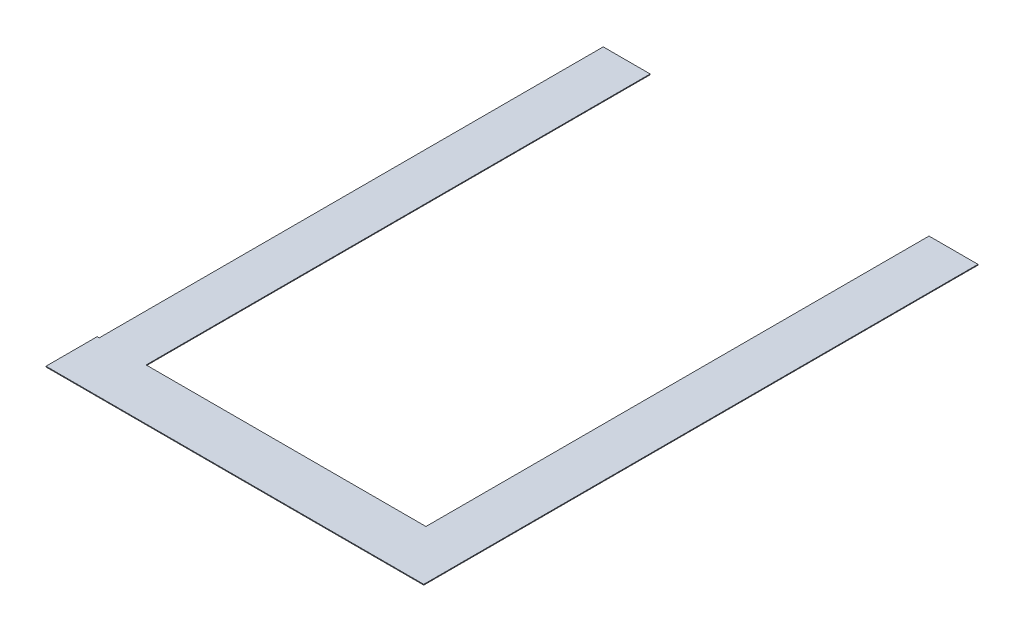
ISO-10303-21;
HEADER;
FILE_DESCRIPTION(('STEP AP214'),'2;1');
FILE_NAME('part.step','',(''),(''),'','','');
FILE_SCHEMA(('AUTOMOTIVE_DESIGN { 1 0 10303 214 1 1 1 1 }'));
ENDSEC;
DATA;
#1=APPLICATION_CONTEXT('core data for automotive mechanical design processes');
#2=APPLICATION_PROTOCOL_DEFINITION('international standard','automotive_design',2000,#1);
#3=PRODUCT_CONTEXT('',#1,'mechanical');
#4=PRODUCT('Part','Part','',(#3));
#5=PRODUCT_RELATED_PRODUCT_CATEGORY('part','',(#4));
#6=PRODUCT_DEFINITION_FORMATION('','',#4);
#7=PRODUCT_DEFINITION_CONTEXT('part definition',#1,'design');
#8=PRODUCT_DEFINITION('design','',#6,#7);
#9=PRODUCT_DEFINITION_SHAPE('','',#8);
#10=(LENGTH_UNIT() NAMED_UNIT(*) SI_UNIT(.MILLI.,.METRE.));
#11=(NAMED_UNIT(*) PLANE_ANGLE_UNIT() SI_UNIT($,.RADIAN.));
#12=(NAMED_UNIT(*) SI_UNIT($,.STERADIAN.) SOLID_ANGLE_UNIT());
#13=UNCERTAINTY_MEASURE_WITH_UNIT(LENGTH_MEASURE(1.E-05),#10,'distance_accuracy_value','');
#14=(GEOMETRIC_REPRESENTATION_CONTEXT(3) GLOBAL_UNCERTAINTY_ASSIGNED_CONTEXT((#13)) GLOBAL_UNIT_ASSIGNED_CONTEXT((#10,
#11,#12)) REPRESENTATION_CONTEXT('',''));
#15=CARTESIAN_POINT('',(0.,0.,0.));
#16=DIRECTION('',(0.,0.,1.));
#17=DIRECTION('',(1.,0.,0.));
#18=AXIS2_PLACEMENT_3D('',#15,#16,#17);
#19=CARTESIAN_POINT('',(4.62818255216973,1.4011,-3.42742028185391));
#20=DIRECTION('',(0.,1.,0.));
#21=DIRECTION('',(0.,0.,1.));
#22=AXIS2_PLACEMENT_3D('',#19,#20,#21);
#23=PLANE('',#22);
#24=DIRECTION('',(0.,0.,1.));
#25=VECTOR('',#24,1.);
#26=CARTESIAN_POINT('',(5.04133181301125,1.4011,-3.80427841803244));
#27=LINE('',#26,#25);
#28=CARTESIAN_POINT('',(5.04133181301125,1.4011,-3.11893098203462));
#29=VERTEX_POINT('',#28);
#30=CARTESIAN_POINT('',(5.04133181301125,1.4011,-3.80427841803244));
#31=VERTEX_POINT('',#30);
#32=EDGE_CURVE('E108',#29,#31,#27,.F.);
#33=ORIENTED_EDGE('',*,*,#32,.F.);
#34=DIRECTION('',(-1.,0.,0.));
#35=VECTOR('',#34,1.);
#36=CARTESIAN_POINT('',(5.10807001996172,1.4011,-3.11893098203462));
#37=LINE('',#36,#35);
#38=CARTESIAN_POINT('',(4.66014241475359,1.4011,-3.11893098203462));
#39=VERTEX_POINT('',#38);
#40=EDGE_CURVE('E137',#39,#29,#37,.F.);
#41=ORIENTED_EDGE('',*,*,#40,.F.);
#42=DIRECTION('',(0.,0.,-1.));
#43=VECTOR('',#42,1.);
#44=CARTESIAN_POINT('',(4.66014241475359,1.4011,-3.04926487408599));
#45=LINE('',#44,#43);
#46=CARTESIAN_POINT('',(4.66014241475359,1.4011,-3.80557568962184));
#47=VERTEX_POINT('',#46);
#48=EDGE_CURVE('E136',#47,#39,#45,.F.);
#49=ORIENTED_EDGE('',*,*,#48,.F.);
#50=DIRECTION('',(-1.,0.,0.));
#51=VECTOR('',#50,1.);
#52=CARTESIAN_POINT('',(4.66014241475359,1.4011,-3.80557568962184));
#53=LINE('',#52,#51);
#54=CARTESIAN_POINT('',(4.59622268958587,1.4011,-3.80557568962184));
#55=VERTEX_POINT('',#54);
#56=EDGE_CURVE('E133',#55,#47,#53,.F.);
#57=ORIENTED_EDGE('',*,*,#56,.F.);
#58=DIRECTION('',(0.,0.,1.));
#59=VECTOR('',#58,1.);
#60=CARTESIAN_POINT('',(4.59622268958587,1.4011,-3.80557568962184));
#61=LINE('',#60,#59);
#62=CARTESIAN_POINT('',(4.59622268958587,1.4011,-3.11893098203462));
#63=VERTEX_POINT('',#62);
#64=EDGE_CURVE('E130',#63,#55,#61,.F.);
#65=ORIENTED_EDGE('',*,*,#64,.F.);
#66=DIRECTION('',(-1.,0.,0.));
#67=VECTOR('',#66,1.);
#68=CARTESIAN_POINT('',(5.10807001996172,1.4011,-3.11893098203462));
#69=LINE('',#68,#67);
#70=CARTESIAN_POINT('',(4.59340420780312,1.4011,-3.11893098203462));
#71=VERTEX_POINT('',#70);
#72=EDGE_CURVE('E127',#71,#63,#69,.F.);
#73=ORIENTED_EDGE('',*,*,#72,.F.);
#74=DIRECTION('',(0.,0.,1.));
#75=VECTOR('',#74,1.);
#76=CARTESIAN_POINT('',(4.59340420780312,1.4011,-3.11893098203462));
#77=LINE('',#76,#75);
#78=CARTESIAN_POINT('',(4.59340420780312,1.4011,-3.04926487408599));
#79=VERTEX_POINT('',#78);
#80=EDGE_CURVE('E124',#79,#71,#77,.F.);
#81=ORIENTED_EDGE('',*,*,#80,.F.);
#82=DIRECTION('',(1.,0.,0.));
#83=VECTOR('',#82,1.);
#84=CARTESIAN_POINT('',(4.59340420780312,1.4011,-3.04926487408599));
#85=LINE('',#84,#83);
#86=CARTESIAN_POINT('',(5.10807001996172,1.4011,-3.04926487408599));
#87=VERTEX_POINT('',#86);
#88=EDGE_CURVE('E99',#87,#79,#85,.F.);
#89=ORIENTED_EDGE('',*,*,#88,.F.);
#90=DIRECTION('',(0.,0.,-1.));
#91=VECTOR('',#90,1.);
#92=CARTESIAN_POINT('',(5.10807001996172,1.4011,-3.04926487408599));
#93=LINE('',#92,#91);
#94=CARTESIAN_POINT('',(5.10807001996172,1.4011,-3.80427841803244));
#95=VERTEX_POINT('',#94);
#96=EDGE_CURVE('E94',#95,#87,#93,.F.);
#97=ORIENTED_EDGE('',*,*,#96,.F.);
#98=DIRECTION('',(-1.,0.,0.));
#99=VECTOR('',#98,1.);
#100=CARTESIAN_POINT('',(5.10807001996172,1.4011,-3.80427841803244));
#101=LINE('',#100,#99);
#102=EDGE_CURVE('E86',#31,#95,#101,.F.);
#103=ORIENTED_EDGE('',*,*,#102,.F.);
#104=EDGE_LOOP('',(#33,#41,#49,#57,#65,#73,#81,#89,#97,#103));
#105=FACE_BOUND('',#104,.T.);
#106=ADVANCED_FACE('F16',(#105),#23,.T.);
#107=CARTESIAN_POINT('',(5.10807001996172,1.4001,-3.04926487408599));
#108=DIRECTION('',(1.,0.,0.));
#109=DIRECTION('',(0.,0.,-1.));
#110=AXIS2_PLACEMENT_3D('',#107,#108,#109);
#111=PLANE('',#110);
#112=ORIENTED_EDGE('',*,*,#96,.T.);
#113=DIRECTION('',(0.,1.,0.));
#114=VECTOR('',#113,1.);
#115=CARTESIAN_POINT('',(5.10807001996172,1.4001,-3.04926487408599));
#116=LINE('',#115,#114);
#117=CARTESIAN_POINT('',(5.10807001996172,1.4001,-3.04926487408599));
#118=VERTEX_POINT('',#117);
#119=EDGE_CURVE('E119',#118,#87,#116,.T.);
#120=ORIENTED_EDGE('',*,*,#119,.F.);
#121=DIRECTION('',(0.,0.,1.));
#122=VECTOR('',#121,1.);
#123=CARTESIAN_POINT('',(5.10807001996172,1.4001,-3.0840979280603));
#124=LINE('',#123,#122);
#125=CARTESIAN_POINT('',(5.10807001996172,1.4001,-3.80427841803244));
#126=VERTEX_POINT('',#125);
#127=EDGE_CURVE('E107',#118,#126,#124,.F.);
#128=ORIENTED_EDGE('',*,*,#127,.T.);
#129=DIRECTION('',(0.,1.,0.));
#130=VECTOR('',#129,1.);
#131=CARTESIAN_POINT('',(5.10807001996172,1.4001,-3.80427841803244));
#132=LINE('',#131,#130);
#133=EDGE_CURVE('E19',#95,#126,#132,.F.);
#134=ORIENTED_EDGE('',*,*,#133,.F.);
#135=EDGE_LOOP('',(#112,#120,#128,#134));
#136=FACE_BOUND('',#135,.T.);
#137=ADVANCED_FACE('F105',(#136),#111,.T.);
#138=CARTESIAN_POINT('',(5.10807001996172,1.4001,-3.80427841803244));
#139=DIRECTION('',(0.,0.,-1.));
#140=DIRECTION('',(-1.,0.,0.));
#141=AXIS2_PLACEMENT_3D('',#138,#139,#140);
#142=PLANE('',#141);
#143=ORIENTED_EDGE('',*,*,#102,.T.);
#144=ORIENTED_EDGE('',*,*,#133,.T.);
#145=DIRECTION('',(1.,0.,0.));
#146=VECTOR('',#145,1.);
#147=CARTESIAN_POINT('',(4.85073711388242,1.4001,-3.80427841803244));
#148=LINE('',#147,#146);
#149=CARTESIAN_POINT('',(5.04133181301125,1.4001,-3.80427841803244));
#150=VERTEX_POINT('',#149);
#151=EDGE_CURVE('E117',#126,#150,#148,.F.);
#152=ORIENTED_EDGE('',*,*,#151,.T.);
#153=DIRECTION('',(0.,1.,0.));
#154=VECTOR('',#153,1.);
#155=CARTESIAN_POINT('',(5.04133181301125,1.4001,-3.80427841803244));
#156=LINE('',#155,#154);
#157=EDGE_CURVE('E92',#31,#150,#156,.F.);
#158=ORIENTED_EDGE('',*,*,#157,.F.);
#159=EDGE_LOOP('',(#143,#144,#152,#158));
#160=FACE_BOUND('',#159,.T.);
#161=ADVANCED_FACE('F88',(#160),#142,.T.);
#162=CARTESIAN_POINT('',(5.04133181301125,1.4001,-3.80427841803244));
#163=DIRECTION('',(-1.,0.,0.));
#164=DIRECTION('',(0.,0.,1.));
#165=AXIS2_PLACEMENT_3D('',#162,#163,#164);
#166=PLANE('',#165);
#167=ORIENTED_EDGE('',*,*,#157,.T.);
#168=DIRECTION('',(0.,0.,1.));
#169=VECTOR('',#168,1.);
#170=CARTESIAN_POINT('',(5.04133181301125,1.4001,-3.0840979280603));
#171=LINE('',#170,#169);
#172=CARTESIAN_POINT('',(5.04133181301125,1.4001,-3.11893098203462));
#173=VERTEX_POINT('',#172);
#174=EDGE_CURVE('E115',#150,#173,#171,.T.);
#175=ORIENTED_EDGE('',*,*,#174,.T.);
#176=DIRECTION('',(0.,1.,0.));
#177=VECTOR('',#176,1.);
#178=CARTESIAN_POINT('',(5.04133181301125,1.4001,-3.11893098203462));
#179=LINE('',#178,#177);
#180=EDGE_CURVE('E112',#29,#173,#179,.F.);
#181=ORIENTED_EDGE('',*,*,#180,.F.);
#182=ORIENTED_EDGE('',*,*,#32,.T.);
#183=EDGE_LOOP('',(#167,#175,#181,#182));
#184=FACE_BOUND('',#183,.T.);
#185=ADVANCED_FACE('F198',(#184),#166,.T.);
#186=CARTESIAN_POINT('',(5.10807001996172,1.4001,-3.11893098203462));
#187=DIRECTION('',(0.,0.,-1.));
#188=DIRECTION('',(-1.,0.,0.));
#189=AXIS2_PLACEMENT_3D('',#186,#187,#188);
#190=PLANE('',#189);
#191=DIRECTION('',(0.,1.,0.));
#192=VECTOR('',#191,1.);
#193=CARTESIAN_POINT('',(4.66014241475359,1.4001,-3.11893098203462));
#194=LINE('',#193,#192);
#195=CARTESIAN_POINT('',(4.66014241475359,1.4001,-3.11893098203462));
#196=VERTEX_POINT('',#195);
#197=EDGE_CURVE('E134',#39,#196,#194,.F.);
#198=ORIENTED_EDGE('',*,*,#197,.F.);
#199=ORIENTED_EDGE('',*,*,#40,.T.);
#200=ORIENTED_EDGE('',*,*,#180,.T.);
#201=DIRECTION('',(1.,0.,0.));
#202=VECTOR('',#201,1.);
#203=CARTESIAN_POINT('',(4.85073711388242,1.4001,-3.11893098203462));
#204=LINE('',#203,#202);
#205=EDGE_CURVE('E144',#173,#196,#204,.F.);
#206=ORIENTED_EDGE('',*,*,#205,.T.);
#207=EDGE_LOOP('',(#198,#199,#200,#206));
#208=FACE_BOUND('',#207,.T.);
#209=ADVANCED_FACE('F196',(#208),#190,.T.);
#210=CARTESIAN_POINT('',(4.66014241475359,1.4001,-3.04926487408599));
#211=DIRECTION('',(1.,0.,0.));
#212=DIRECTION('',(0.,0.,-1.));
#213=AXIS2_PLACEMENT_3D('',#210,#211,#212);
#214=PLANE('',#213);
#215=DIRECTION('',(0.,1.,0.));
#216=VECTOR('',#215,1.);
#217=CARTESIAN_POINT('',(4.66014241475359,1.4001,-3.80557568962184));
#218=LINE('',#217,#216);
#219=CARTESIAN_POINT('',(4.66014241475359,1.4001,-3.80557568962184));
#220=VERTEX_POINT('',#219);
#221=EDGE_CURVE('E131',#47,#220,#218,.F.);
#222=ORIENTED_EDGE('',*,*,#221,.F.);
#223=ORIENTED_EDGE('',*,*,#48,.T.);
#224=ORIENTED_EDGE('',*,*,#197,.T.);
#225=DIRECTION('',(0.,0.,1.));
#226=VECTOR('',#225,1.);
#227=CARTESIAN_POINT('',(4.66014241475359,1.4001,-3.0840979280603));
#228=LINE('',#227,#226);
#229=EDGE_CURVE('E146',#196,#220,#228,.F.);
#230=ORIENTED_EDGE('',*,*,#229,.T.);
#231=EDGE_LOOP('',(#222,#223,#224,#230));
#232=FACE_BOUND('',#231,.T.);
#233=ADVANCED_FACE('F193',(#232),#214,.T.);
#234=CARTESIAN_POINT('',(4.66014241475359,1.4001,-3.80557568962184));
#235=DIRECTION('',(0.,0.,-1.));
#236=DIRECTION('',(-1.,0.,0.));
#237=AXIS2_PLACEMENT_3D('',#234,#235,#236);
#238=PLANE('',#237);
#239=ORIENTED_EDGE('',*,*,#56,.T.);
#240=ORIENTED_EDGE('',*,*,#221,.T.);
#241=DIRECTION('',(1.,0.,0.));
#242=VECTOR('',#241,1.);
#243=CARTESIAN_POINT('',(4.85073711388242,1.4001,-3.80557568962184));
#244=LINE('',#243,#242);
#245=CARTESIAN_POINT('',(4.59622268958587,1.4001,-3.80557568962184));
#246=VERTEX_POINT('',#245);
#247=EDGE_CURVE('E151',#220,#246,#244,.F.);
#248=ORIENTED_EDGE('',*,*,#247,.T.);
#249=DIRECTION('',(0.,1.,0.));
#250=VECTOR('',#249,1.);
#251=CARTESIAN_POINT('',(4.59622268958587,1.4001,-3.80557568962184));
#252=LINE('',#251,#250);
#253=EDGE_CURVE('E128',#55,#246,#252,.F.);
#254=ORIENTED_EDGE('',*,*,#253,.F.);
#255=EDGE_LOOP('',(#239,#240,#248,#254));
#256=FACE_BOUND('',#255,.T.);
#257=ADVANCED_FACE('F189',(#256),#238,.T.);
#258=CARTESIAN_POINT('',(4.59622268958587,1.4001,-3.80557568962184));
#259=DIRECTION('',(-1.,0.,0.));
#260=DIRECTION('',(0.,0.,1.));
#261=AXIS2_PLACEMENT_3D('',#258,#259,#260);
#262=PLANE('',#261);
#263=ORIENTED_EDGE('',*,*,#253,.T.);
#264=DIRECTION('',(0.,0.,1.));
#265=VECTOR('',#264,1.);
#266=CARTESIAN_POINT('',(4.59622268958587,1.4001,-3.0840979280603));
#267=LINE('',#266,#265);
#268=CARTESIAN_POINT('',(4.59622268958587,1.4001,-3.11893098203462));
#269=VERTEX_POINT('',#268);
#270=EDGE_CURVE('E155',#246,#269,#267,.T.);
#271=ORIENTED_EDGE('',*,*,#270,.T.);
#272=DIRECTION('',(0.,1.,0.));
#273=VECTOR('',#272,1.);
#274=CARTESIAN_POINT('',(4.59622268958587,1.4001,-3.11893098203462));
#275=LINE('',#274,#273);
#276=EDGE_CURVE('E125',#63,#269,#275,.F.);
#277=ORIENTED_EDGE('',*,*,#276,.F.);
#278=ORIENTED_EDGE('',*,*,#64,.T.);
#279=EDGE_LOOP('',(#263,#271,#277,#278));
#280=FACE_BOUND('',#279,.T.);
#281=ADVANCED_FACE('F183',(#280),#262,.T.);
#282=CARTESIAN_POINT('',(5.10807001996172,1.4001,-3.11893098203462));
#283=DIRECTION('',(0.,0.,-1.));
#284=DIRECTION('',(-1.,0.,0.));
#285=AXIS2_PLACEMENT_3D('',#282,#283,#284);
#286=PLANE('',#285);
#287=DIRECTION('',(0.,1.,0.));
#288=VECTOR('',#287,1.);
#289=CARTESIAN_POINT('',(4.59340420780312,1.4001,-3.11893098203462));
#290=LINE('',#289,#288);
#291=CARTESIAN_POINT('',(4.59340420780312,1.4001,-3.11893098203462));
#292=VERTEX_POINT('',#291);
#293=EDGE_CURVE('E122',#71,#292,#290,.F.);
#294=ORIENTED_EDGE('',*,*,#293,.F.);
#295=ORIENTED_EDGE('',*,*,#72,.T.);
#296=ORIENTED_EDGE('',*,*,#276,.T.);
#297=DIRECTION('',(1.,0.,0.));
#298=VECTOR('',#297,1.);
#299=CARTESIAN_POINT('',(4.85073711388242,1.4001,-3.11893098203462));
#300=LINE('',#299,#298);
#301=EDGE_CURVE('E159',#269,#292,#300,.F.);
#302=ORIENTED_EDGE('',*,*,#301,.T.);
#303=EDGE_LOOP('',(#294,#295,#296,#302));
#304=FACE_BOUND('',#303,.T.);
#305=ADVANCED_FACE('F180',(#304),#286,.T.);
#306=CARTESIAN_POINT('',(4.59340420780312,1.4001,-3.11893098203462));
#307=DIRECTION('',(-1.,0.,0.));
#308=DIRECTION('',(0.,0.,1.));
#309=AXIS2_PLACEMENT_3D('',#306,#307,#308);
#310=PLANE('',#309);
#311=ORIENTED_EDGE('',*,*,#80,.T.);
#312=ORIENTED_EDGE('',*,*,#293,.T.);
#313=DIRECTION('',(0.,0.,1.));
#314=VECTOR('',#313,1.);
#315=CARTESIAN_POINT('',(4.59340420780312,1.4001,-3.0840979280603));
#316=LINE('',#315,#314);
#317=CARTESIAN_POINT('',(4.59340420780312,1.4001,-3.04926487408599));
#318=VERTEX_POINT('',#317);
#319=EDGE_CURVE('E25',#292,#318,#316,.T.);
#320=ORIENTED_EDGE('',*,*,#319,.T.);
#321=DIRECTION('',(0.,1.,0.));
#322=VECTOR('',#321,1.);
#323=CARTESIAN_POINT('',(4.59340420780312,1.4001,-3.04926487408599));
#324=LINE('',#323,#322);
#325=EDGE_CURVE('E33',#79,#318,#324,.F.);
#326=ORIENTED_EDGE('',*,*,#325,.F.);
#327=EDGE_LOOP('',(#311,#312,#320,#326));
#328=FACE_BOUND('',#327,.T.);
#329=ADVANCED_FACE('F173',(#328),#310,.T.);
#330=CARTESIAN_POINT('',(4.59340420780312,1.4001,-3.04926487408599));
#331=DIRECTION('',(0.,0.,1.));
#332=DIRECTION('',(1.,0.,0.));
#333=AXIS2_PLACEMENT_3D('',#330,#331,#332);
#334=PLANE('',#333);
#335=DIRECTION('',(1.,0.,0.));
#336=VECTOR('',#335,1.);
#337=CARTESIAN_POINT('',(4.85073711388242,1.4001,-3.04926487408599));
#338=LINE('',#337,#336);
#339=EDGE_CURVE('E11',#318,#118,#338,.T.);
#340=ORIENTED_EDGE('',*,*,#339,.T.);
#341=ORIENTED_EDGE('',*,*,#119,.T.);
#342=ORIENTED_EDGE('',*,*,#88,.T.);
#343=ORIENTED_EDGE('',*,*,#325,.T.);
#344=EDGE_LOOP('',(#340,#341,#342,#343));
#345=FACE_BOUND('',#344,.T.);
#346=ADVANCED_FACE('F168',(#345),#334,.T.);
#347=CARTESIAN_POINT('',(4.85073711388242,1.4001,-3.0840979280603));
#348=DIRECTION('',(0.,1.,0.));
#349=DIRECTION('',(0.,0.,1.));
#350=AXIS2_PLACEMENT_3D('',#347,#348,#349);
#351=PLANE('',#350);
#352=ORIENTED_EDGE('',*,*,#319,.F.);
#353=ORIENTED_EDGE('',*,*,#301,.F.);
#354=ORIENTED_EDGE('',*,*,#270,.F.);
#355=ORIENTED_EDGE('',*,*,#247,.F.);
#356=ORIENTED_EDGE('',*,*,#229,.F.);
#357=ORIENTED_EDGE('',*,*,#205,.F.);
#358=ORIENTED_EDGE('',*,*,#174,.F.);
#359=ORIENTED_EDGE('',*,*,#151,.F.);
#360=ORIENTED_EDGE('',*,*,#127,.F.);
#361=ORIENTED_EDGE('',*,*,#339,.F.);
#362=EDGE_LOOP('',(#352,#353,#354,#355,#356,#357,#358,#359,#360,#361));
#363=FACE_BOUND('',#362,.T.);
#364=ADVANCED_FACE('F177',(#363),#351,.F.);
#365=CLOSED_SHELL('',(#106,#137,#161,#185,#209,#233,#257,#281,#305,#329,#346,#364));
#366=MANIFOLD_SOLID_BREP('B1',#365);
#367=ADVANCED_BREP_SHAPE_REPRESENTATION('',(#18,#366),#14);
#368=SHAPE_DEFINITION_REPRESENTATION(#9,#367);
ENDSEC;
END-ISO-10303-21;
